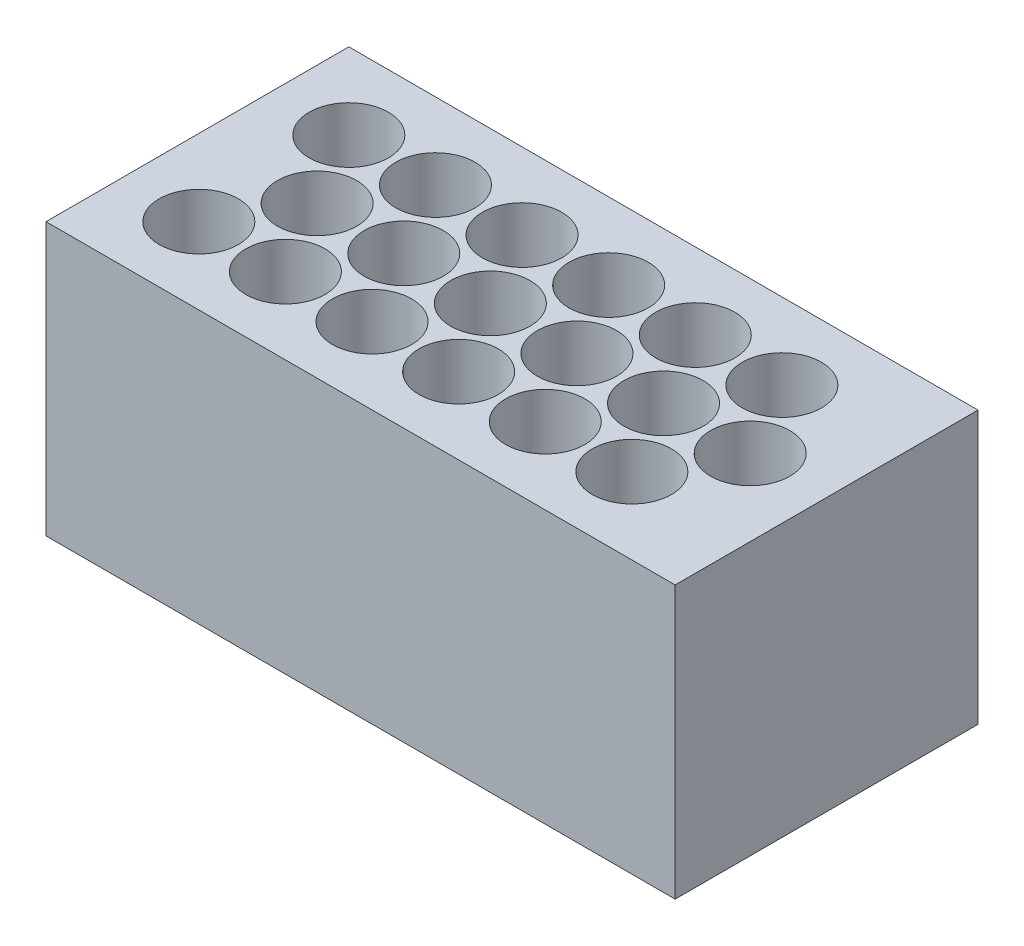
ISO-10303-21;
HEADER;
FILE_DESCRIPTION(('STEP AP214'),'2;1');
FILE_NAME('part.step','',(''),(''),'','','');
FILE_SCHEMA(('AUTOMOTIVE_DESIGN { 1 0 10303 214 1 1 1 1 }'));
ENDSEC;
DATA;
#1=APPLICATION_CONTEXT('core data for automotive mechanical design processes');
#2=APPLICATION_PROTOCOL_DEFINITION('international standard','automotive_design',2000,#1);
#3=PRODUCT_CONTEXT('',#1,'mechanical');
#4=PRODUCT('Part','Part','',(#3));
#5=PRODUCT_RELATED_PRODUCT_CATEGORY('part','',(#4));
#6=PRODUCT_DEFINITION_FORMATION('','',#4);
#7=PRODUCT_DEFINITION_CONTEXT('part definition',#1,'design');
#8=PRODUCT_DEFINITION('design','',#6,#7);
#9=PRODUCT_DEFINITION_SHAPE('','',#8);
#10=(LENGTH_UNIT() NAMED_UNIT(*) SI_UNIT(.MILLI.,.METRE.));
#11=(NAMED_UNIT(*) PLANE_ANGLE_UNIT() SI_UNIT($,.RADIAN.));
#12=(NAMED_UNIT(*) SI_UNIT($,.STERADIAN.) SOLID_ANGLE_UNIT());
#13=UNCERTAINTY_MEASURE_WITH_UNIT(LENGTH_MEASURE(1.E-05),#10,'distance_accuracy_value','');
#14=(GEOMETRIC_REPRESENTATION_CONTEXT(3) GLOBAL_UNCERTAINTY_ASSIGNED_CONTEXT((#13)) GLOBAL_UNIT_ASSIGNED_CONTEXT((#10,
#11,#12)) REPRESENTATION_CONTEXT('',''));
#15=CARTESIAN_POINT('',(0.,0.,0.));
#16=DIRECTION('',(0.,0.,1.));
#17=DIRECTION('',(1.,0.,0.));
#18=AXIS2_PLACEMENT_3D('',#15,#16,#17);
#19=CARTESIAN_POINT('',(0.,74.,0.));
#20=DIRECTION('',(0.,-1.,0.));
#21=DIRECTION('',(0.,0.,-1.));
#22=AXIS2_PLACEMENT_3D('',#19,#20,#21);
#23=PLANE('',#22);
#24=DIRECTION('',(0.,0.,1.));
#25=VECTOR('',#24,1.);
#26=CARTESIAN_POINT('',(-32.5499999999999,74.,41.1698982591236));
#27=LINE('',#26,#25);
#28=CARTESIAN_POINT('',(-32.5499999999999,74.,-41.1698982591236));
#29=VERTEX_POINT('',#28);
#30=CARTESIAN_POINT('',(-32.5499999999999,74.,41.1698982591236));
#31=VERTEX_POINT('',#30);
#32=EDGE_CURVE('E92',#29,#31,#27,.T.);
#33=ORIENTED_EDGE('',*,*,#32,.T.);
#34=DIRECTION('',(1.,0.,0.));
#35=VECTOR('',#34,1.);
#36=CARTESIAN_POINT('',(-32.5499999999999,74.,41.1698982591236));
#37=LINE('',#36,#35);
#38=CARTESIAN_POINT('',(138.525,74.,41.1698982591236));
#39=VERTEX_POINT('',#38);
#40=EDGE_CURVE('E87',#31,#39,#37,.T.);
#41=ORIENTED_EDGE('',*,*,#40,.T.);
#42=DIRECTION('',(0.,0.,-1.));
#43=VECTOR('',#42,1.);
#44=CARTESIAN_POINT('',(138.525,74.,41.1698982591236));
#45=LINE('',#44,#43);
#46=CARTESIAN_POINT('',(138.525,74.,-41.1698982591236));
#47=VERTEX_POINT('',#46);
#48=EDGE_CURVE('E90',#39,#47,#45,.T.);
#49=ORIENTED_EDGE('',*,*,#48,.T.);
#50=DIRECTION('',(-1.,0.,0.));
#51=VECTOR('',#50,1.);
#52=CARTESIAN_POINT('',(-32.5499999999999,74.,-41.1698982591236));
#53=LINE('',#52,#51);
#54=EDGE_CURVE('E57',#47,#29,#53,.T.);
#55=ORIENTED_EDGE('',*,*,#54,.T.);
#56=EDGE_LOOP('',(#33,#41,#49,#55));
#57=FACE_BOUND('',#56,.T.);
#58=CARTESIAN_POINT('',(0.,74.,0.));
#59=DIRECTION('',(0.,1.,0.));
#60=DIRECTION('',(0.,0.,1.));
#61=AXIS2_PLACEMENT_3D('',#58,#59,#60);
#62=CIRCLE('',#61,10.775);
#63=CARTESIAN_POINT('',(0.,74.,10.775));
#64=VERTEX_POINT('',#63);
#65=EDGE_CURVE('E107',#64,#64,#62,.T.);
#66=ORIENTED_EDGE('',*,*,#65,.F.);
#67=EDGE_LOOP('',(#66));
#68=FACE_BOUND('',#67,.T.);
#69=CARTESIAN_POINT('',(-11.7749999999999,74.,-20.3948982591236));
#70=DIRECTION('',(0.,1.,0.));
#71=DIRECTION('',(0.,0.,1.));
#72=AXIS2_PLACEMENT_3D('',#69,#70,#71);
#73=CIRCLE('',#72,10.775);
#74=CARTESIAN_POINT('',(-11.7749999999999,74.,-9.6198982591236));
#75=VERTEX_POINT('',#74);
#76=EDGE_CURVE('E122',#75,#75,#73,.T.);
#77=ORIENTED_EDGE('',*,*,#76,.F.);
#78=EDGE_LOOP('',(#77));
#79=FACE_BOUND('',#78,.T.);
#80=CARTESIAN_POINT('',(-11.7749999999999,74.,20.3948982591236));
#81=DIRECTION('',(0.,1.,0.));
#82=DIRECTION('',(0.,0.,1.));
#83=AXIS2_PLACEMENT_3D('',#80,#81,#82);
#84=CIRCLE('',#83,10.775);
#85=CARTESIAN_POINT('',(-11.7749999999999,74.,31.1698982591236));
#86=VERTEX_POINT('',#85);
#87=EDGE_CURVE('E128',#86,#86,#84,.T.);
#88=ORIENTED_EDGE('',*,*,#87,.F.);
#89=EDGE_LOOP('',(#88));
#90=FACE_BOUND('',#89,.T.);
#91=CARTESIAN_POINT('',(23.55,74.,0.));
#92=DIRECTION('',(0.,1.,0.));
#93=DIRECTION('',(0.,0.,1.));
#94=AXIS2_PLACEMENT_3D('',#91,#92,#93);
#95=CIRCLE('',#94,10.775);
#96=CARTESIAN_POINT('',(23.55,74.,10.775));
#97=VERTEX_POINT('',#96);
#98=EDGE_CURVE('E134',#97,#97,#95,.T.);
#99=ORIENTED_EDGE('',*,*,#98,.F.);
#100=EDGE_LOOP('',(#99));
#101=FACE_BOUND('',#100,.T.);
#102=CARTESIAN_POINT('',(11.7750000000001,74.,-20.3948982591236));
#103=DIRECTION('',(0.,1.,0.));
#104=DIRECTION('',(0.,0.,1.));
#105=AXIS2_PLACEMENT_3D('',#102,#103,#104);
#106=CIRCLE('',#105,10.775);
#107=CARTESIAN_POINT('',(11.7750000000001,74.,-9.6198982591236));
#108=VERTEX_POINT('',#107);
#109=EDGE_CURVE('E140',#108,#108,#106,.T.);
#110=ORIENTED_EDGE('',*,*,#109,.F.);
#111=EDGE_LOOP('',(#110));
#112=FACE_BOUND('',#111,.T.);
#113=CARTESIAN_POINT('',(11.7750000000001,74.,20.3948982591236));
#114=DIRECTION('',(0.,1.,0.));
#115=DIRECTION('',(0.,0.,1.));
#116=AXIS2_PLACEMENT_3D('',#113,#114,#115);
#117=CIRCLE('',#116,10.775);
#118=CARTESIAN_POINT('',(11.7750000000001,74.,31.1698982591236));
#119=VERTEX_POINT('',#118);
#120=EDGE_CURVE('E146',#119,#119,#117,.T.);
#121=ORIENTED_EDGE('',*,*,#120,.F.);
#122=EDGE_LOOP('',(#121));
#123=FACE_BOUND('',#122,.T.);
#124=CARTESIAN_POINT('',(47.1,74.,0.));
#125=DIRECTION('',(0.,1.,0.));
#126=DIRECTION('',(0.,0.,1.));
#127=AXIS2_PLACEMENT_3D('',#124,#125,#126);
#128=CIRCLE('',#127,10.775);
#129=CARTESIAN_POINT('',(47.1,74.,10.775));
#130=VERTEX_POINT('',#129);
#131=EDGE_CURVE('E152',#130,#130,#128,.T.);
#132=ORIENTED_EDGE('',*,*,#131,.F.);
#133=EDGE_LOOP('',(#132));
#134=FACE_BOUND('',#133,.T.);
#135=CARTESIAN_POINT('',(35.3250000000001,74.,-20.3948982591236));
#136=DIRECTION('',(0.,1.,0.));
#137=DIRECTION('',(0.,0.,1.));
#138=AXIS2_PLACEMENT_3D('',#135,#136,#137);
#139=CIRCLE('',#138,10.775);
#140=CARTESIAN_POINT('',(35.3250000000001,74.,-9.61989825912359));
#141=VERTEX_POINT('',#140);
#142=EDGE_CURVE('E158',#141,#141,#139,.T.);
#143=ORIENTED_EDGE('',*,*,#142,.F.);
#144=EDGE_LOOP('',(#143));
#145=FACE_BOUND('',#144,.T.);
#146=CARTESIAN_POINT('',(35.3250000000001,74.,20.3948982591236));
#147=DIRECTION('',(0.,1.,0.));
#148=DIRECTION('',(0.,0.,1.));
#149=AXIS2_PLACEMENT_3D('',#146,#147,#148);
#150=CIRCLE('',#149,10.775);
#151=CARTESIAN_POINT('',(35.3250000000001,74.,31.1698982591236));
#152=VERTEX_POINT('',#151);
#153=EDGE_CURVE('E164',#152,#152,#150,.T.);
#154=ORIENTED_EDGE('',*,*,#153,.F.);
#155=EDGE_LOOP('',(#154));
#156=FACE_BOUND('',#155,.T.);
#157=CARTESIAN_POINT('',(70.65,74.,0.));
#158=DIRECTION('',(0.,1.,0.));
#159=DIRECTION('',(0.,0.,1.));
#160=AXIS2_PLACEMENT_3D('',#157,#158,#159);
#161=CIRCLE('',#160,10.775);
#162=CARTESIAN_POINT('',(70.65,74.,10.775));
#163=VERTEX_POINT('',#162);
#164=EDGE_CURVE('E170',#163,#163,#161,.T.);
#165=ORIENTED_EDGE('',*,*,#164,.F.);
#166=EDGE_LOOP('',(#165));
#167=FACE_BOUND('',#166,.T.);
#168=CARTESIAN_POINT('',(58.8750000000001,74.,-20.3948982591236));
#169=DIRECTION('',(0.,1.,0.));
#170=DIRECTION('',(0.,0.,1.));
#171=AXIS2_PLACEMENT_3D('',#168,#169,#170);
#172=CIRCLE('',#171,10.775);
#173=CARTESIAN_POINT('',(58.8750000000001,74.,-9.61989825912359));
#174=VERTEX_POINT('',#173);
#175=EDGE_CURVE('E176',#174,#174,#172,.T.);
#176=ORIENTED_EDGE('',*,*,#175,.F.);
#177=EDGE_LOOP('',(#176));
#178=FACE_BOUND('',#177,.T.);
#179=CARTESIAN_POINT('',(58.8750000000001,74.,20.3948982591236));
#180=DIRECTION('',(0.,1.,0.));
#181=DIRECTION('',(0.,0.,1.));
#182=AXIS2_PLACEMENT_3D('',#179,#180,#181);
#183=CIRCLE('',#182,10.775);
#184=CARTESIAN_POINT('',(58.8750000000001,74.,31.1698982591236));
#185=VERTEX_POINT('',#184);
#186=EDGE_CURVE('E182',#185,#185,#183,.T.);
#187=ORIENTED_EDGE('',*,*,#186,.F.);
#188=EDGE_LOOP('',(#187));
#189=FACE_BOUND('',#188,.T.);
#190=CARTESIAN_POINT('',(94.2,74.,0.));
#191=DIRECTION('',(0.,1.,0.));
#192=DIRECTION('',(0.,0.,1.));
#193=AXIS2_PLACEMENT_3D('',#190,#191,#192);
#194=CIRCLE('',#193,10.775);
#195=CARTESIAN_POINT('',(94.2,74.,10.775));
#196=VERTEX_POINT('',#195);
#197=EDGE_CURVE('E188',#196,#196,#194,.T.);
#198=ORIENTED_EDGE('',*,*,#197,.F.);
#199=EDGE_LOOP('',(#198));
#200=FACE_BOUND('',#199,.T.);
#201=CARTESIAN_POINT('',(82.4250000000001,74.,-20.3948982591236));
#202=DIRECTION('',(0.,1.,0.));
#203=DIRECTION('',(0.,0.,1.));
#204=AXIS2_PLACEMENT_3D('',#201,#202,#203);
#205=CIRCLE('',#204,10.775);
#206=CARTESIAN_POINT('',(82.4250000000001,74.,-9.61989825912359));
#207=VERTEX_POINT('',#206);
#208=EDGE_CURVE('E194',#207,#207,#205,.T.);
#209=ORIENTED_EDGE('',*,*,#208,.F.);
#210=EDGE_LOOP('',(#209));
#211=FACE_BOUND('',#210,.T.);
#212=CARTESIAN_POINT('',(82.4250000000001,74.,20.3948982591236));
#213=DIRECTION('',(0.,1.,0.));
#214=DIRECTION('',(0.,0.,1.));
#215=AXIS2_PLACEMENT_3D('',#212,#213,#214);
#216=CIRCLE('',#215,10.775);
#217=CARTESIAN_POINT('',(82.4250000000001,74.,31.1698982591236));
#218=VERTEX_POINT('',#217);
#219=EDGE_CURVE('E200',#218,#218,#216,.T.);
#220=ORIENTED_EDGE('',*,*,#219,.F.);
#221=EDGE_LOOP('',(#220));
#222=FACE_BOUND('',#221,.T.);
#223=CARTESIAN_POINT('',(117.75,74.,0.));
#224=DIRECTION('',(0.,1.,0.));
#225=DIRECTION('',(0.,0.,1.));
#226=AXIS2_PLACEMENT_3D('',#223,#224,#225);
#227=CIRCLE('',#226,10.775);
#228=CARTESIAN_POINT('',(117.75,74.,10.775));
#229=VERTEX_POINT('',#228);
#230=EDGE_CURVE('E206',#229,#229,#227,.T.);
#231=ORIENTED_EDGE('',*,*,#230,.F.);
#232=EDGE_LOOP('',(#231));
#233=FACE_BOUND('',#232,.T.);
#234=CARTESIAN_POINT('',(105.975,74.,-20.3948982591236));
#235=DIRECTION('',(0.,1.,0.));
#236=DIRECTION('',(0.,0.,1.));
#237=AXIS2_PLACEMENT_3D('',#234,#235,#236);
#238=CIRCLE('',#237,10.775);
#239=CARTESIAN_POINT('',(105.975,74.,-9.61989825912359));
#240=VERTEX_POINT('',#239);
#241=EDGE_CURVE('E212',#240,#240,#238,.T.);
#242=ORIENTED_EDGE('',*,*,#241,.F.);
#243=EDGE_LOOP('',(#242));
#244=FACE_BOUND('',#243,.T.);
#245=CARTESIAN_POINT('',(105.975,74.,20.3948982591236));
#246=DIRECTION('',(0.,1.,0.));
#247=DIRECTION('',(0.,0.,1.));
#248=AXIS2_PLACEMENT_3D('',#245,#246,#247);
#249=CIRCLE('',#248,10.775);
#250=CARTESIAN_POINT('',(105.975,74.,31.1698982591236));
#251=VERTEX_POINT('',#250);
#252=EDGE_CURVE('E218',#251,#251,#249,.T.);
#253=ORIENTED_EDGE('',*,*,#252,.F.);
#254=EDGE_LOOP('',(#253));
#255=FACE_BOUND('',#254,.T.);
#256=ADVANCED_FACE('F40',(#57,#68,#79,#90,#101,#112,#123,#134,#145,#156,#167,#178,#189,#200,
#211,#222,#233,#244,#255),#23,.F.);
#257=CARTESIAN_POINT('',(0.,0.,0.));
#258=DIRECTION('',(0.,-1.,0.));
#259=DIRECTION('',(0.,0.,-1.));
#260=AXIS2_PLACEMENT_3D('',#257,#258,#259);
#261=PLANE('',#260);
#262=CARTESIAN_POINT('',(105.975,0.,-20.3948982591236));
#263=DIRECTION('',(0.,1.,0.));
#264=DIRECTION('',(0.,0.,1.));
#265=AXIS2_PLACEMENT_3D('',#262,#263,#264);
#266=CIRCLE('',#265,10.775);
#267=CARTESIAN_POINT('',(105.975,0.,-9.61989825912359));
#268=VERTEX_POINT('',#267);
#269=EDGE_CURVE('E215',#268,#268,#266,.T.);
#270=ORIENTED_EDGE('',*,*,#269,.T.);
#271=EDGE_LOOP('',(#270));
#272=FACE_BOUND('',#271,.T.);
#273=CARTESIAN_POINT('',(82.4250000000001,0.,20.3948982591236));
#274=DIRECTION('',(0.,1.,0.));
#275=DIRECTION('',(0.,0.,1.));
#276=AXIS2_PLACEMENT_3D('',#273,#274,#275);
#277=CIRCLE('',#276,10.775);
#278=CARTESIAN_POINT('',(82.4250000000001,0.,31.1698982591236));
#279=VERTEX_POINT('',#278);
#280=EDGE_CURVE('E203',#279,#279,#277,.T.);
#281=ORIENTED_EDGE('',*,*,#280,.T.);
#282=EDGE_LOOP('',(#281));
#283=FACE_BOUND('',#282,.T.);
#284=CARTESIAN_POINT('',(94.2,0.,0.));
#285=DIRECTION('',(0.,1.,0.));
#286=DIRECTION('',(0.,0.,1.));
#287=AXIS2_PLACEMENT_3D('',#284,#285,#286);
#288=CIRCLE('',#287,10.775);
#289=CARTESIAN_POINT('',(94.2,0.,10.775));
#290=VERTEX_POINT('',#289);
#291=EDGE_CURVE('E191',#290,#290,#288,.T.);
#292=ORIENTED_EDGE('',*,*,#291,.T.);
#293=EDGE_LOOP('',(#292));
#294=FACE_BOUND('',#293,.T.);
#295=CARTESIAN_POINT('',(58.8750000000001,0.,-20.3948982591236));
#296=DIRECTION('',(0.,1.,0.));
#297=DIRECTION('',(0.,0.,1.));
#298=AXIS2_PLACEMENT_3D('',#295,#296,#297);
#299=CIRCLE('',#298,10.775);
#300=CARTESIAN_POINT('',(58.8750000000001,0.,-9.61989825912359));
#301=VERTEX_POINT('',#300);
#302=EDGE_CURVE('E179',#301,#301,#299,.T.);
#303=ORIENTED_EDGE('',*,*,#302,.T.);
#304=EDGE_LOOP('',(#303));
#305=FACE_BOUND('',#304,.T.);
#306=CARTESIAN_POINT('',(35.3250000000001,0.,20.3948982591236));
#307=DIRECTION('',(0.,1.,0.));
#308=DIRECTION('',(0.,0.,1.));
#309=AXIS2_PLACEMENT_3D('',#306,#307,#308);
#310=CIRCLE('',#309,10.775);
#311=CARTESIAN_POINT('',(35.3250000000001,0.,31.1698982591236));
#312=VERTEX_POINT('',#311);
#313=EDGE_CURVE('E167',#312,#312,#310,.T.);
#314=ORIENTED_EDGE('',*,*,#313,.T.);
#315=EDGE_LOOP('',(#314));
#316=FACE_BOUND('',#315,.T.);
#317=CARTESIAN_POINT('',(47.1,0.,0.));
#318=DIRECTION('',(0.,1.,0.));
#319=DIRECTION('',(0.,0.,1.));
#320=AXIS2_PLACEMENT_3D('',#317,#318,#319);
#321=CIRCLE('',#320,10.775);
#322=CARTESIAN_POINT('',(47.1,0.,10.775));
#323=VERTEX_POINT('',#322);
#324=EDGE_CURVE('E155',#323,#323,#321,.T.);
#325=ORIENTED_EDGE('',*,*,#324,.T.);
#326=EDGE_LOOP('',(#325));
#327=FACE_BOUND('',#326,.T.);
#328=CARTESIAN_POINT('',(11.7750000000001,0.,-20.3948982591236));
#329=DIRECTION('',(0.,1.,0.));
#330=DIRECTION('',(0.,0.,1.));
#331=AXIS2_PLACEMENT_3D('',#328,#329,#330);
#332=CIRCLE('',#331,10.775);
#333=CARTESIAN_POINT('',(11.7750000000001,0.,-9.6198982591236));
#334=VERTEX_POINT('',#333);
#335=EDGE_CURVE('E143',#334,#334,#332,.T.);
#336=ORIENTED_EDGE('',*,*,#335,.T.);
#337=EDGE_LOOP('',(#336));
#338=FACE_BOUND('',#337,.T.);
#339=CARTESIAN_POINT('',(-11.7749999999999,0.,20.3948982591236));
#340=DIRECTION('',(0.,1.,0.));
#341=DIRECTION('',(0.,0.,1.));
#342=AXIS2_PLACEMENT_3D('',#339,#340,#341);
#343=CIRCLE('',#342,10.775);
#344=CARTESIAN_POINT('',(-11.7749999999999,0.,31.1698982591236));
#345=VERTEX_POINT('',#344);
#346=EDGE_CURVE('E131',#345,#345,#343,.T.);
#347=ORIENTED_EDGE('',*,*,#346,.T.);
#348=EDGE_LOOP('',(#347));
#349=FACE_BOUND('',#348,.T.);
#350=CARTESIAN_POINT('',(0.,0.,0.));
#351=DIRECTION('',(0.,1.,0.));
#352=DIRECTION('',(0.,0.,1.));
#353=AXIS2_PLACEMENT_3D('',#350,#351,#352);
#354=CIRCLE('',#353,10.775);
#355=CARTESIAN_POINT('',(0.,0.,10.775));
#356=VERTEX_POINT('',#355);
#357=EDGE_CURVE('E119',#356,#356,#354,.T.);
#358=ORIENTED_EDGE('',*,*,#357,.T.);
#359=EDGE_LOOP('',(#358));
#360=FACE_BOUND('',#359,.T.);
#361=DIRECTION('',(0.,0.,1.));
#362=VECTOR('',#361,1.);
#363=CARTESIAN_POINT('',(-32.5499999999999,0.,41.1698982591236));
#364=LINE('',#363,#362);
#365=CARTESIAN_POINT('',(-32.5499999999999,0.,-41.1698982591236));
#366=VERTEX_POINT('',#365);
#367=CARTESIAN_POINT('',(-32.5499999999999,0.,41.1698982591236));
#368=VERTEX_POINT('',#367);
#369=EDGE_CURVE('E104',#366,#368,#364,.T.);
#370=ORIENTED_EDGE('',*,*,#369,.F.);
#371=DIRECTION('',(-1.,0.,0.));
#372=VECTOR('',#371,1.);
#373=CARTESIAN_POINT('',(-32.5499999999999,0.,-41.1698982591236));
#374=LINE('',#373,#372);
#375=CARTESIAN_POINT('',(138.525,0.,-41.1698982591236));
#376=VERTEX_POINT('',#375);
#377=EDGE_CURVE('E80',#376,#366,#374,.T.);
#378=ORIENTED_EDGE('',*,*,#377,.F.);
#379=DIRECTION('',(0.,0.,-1.));
#380=VECTOR('',#379,1.);
#381=CARTESIAN_POINT('',(138.525,0.,41.1698982591236));
#382=LINE('',#381,#380);
#383=CARTESIAN_POINT('',(138.525,0.,41.1698982591236));
#384=VERTEX_POINT('',#383);
#385=EDGE_CURVE('E74',#384,#376,#382,.T.);
#386=ORIENTED_EDGE('',*,*,#385,.F.);
#387=DIRECTION('',(1.,0.,0.));
#388=VECTOR('',#387,1.);
#389=CARTESIAN_POINT('',(-32.5499999999999,0.,41.1698982591236));
#390=LINE('',#389,#388);
#391=EDGE_CURVE('E96',#368,#384,#390,.T.);
#392=ORIENTED_EDGE('',*,*,#391,.F.);
#393=EDGE_LOOP('',(#370,#378,#386,#392));
#394=FACE_BOUND('',#393,.T.);
#395=CARTESIAN_POINT('',(-11.7749999999999,0.,-20.3948982591236));
#396=DIRECTION('',(0.,1.,0.));
#397=DIRECTION('',(0.,0.,1.));
#398=AXIS2_PLACEMENT_3D('',#395,#396,#397);
#399=CIRCLE('',#398,10.775);
#400=CARTESIAN_POINT('',(-11.7749999999999,0.,-9.6198982591236));
#401=VERTEX_POINT('',#400);
#402=EDGE_CURVE('E125',#401,#401,#399,.T.);
#403=ORIENTED_EDGE('',*,*,#402,.T.);
#404=EDGE_LOOP('',(#403));
#405=FACE_BOUND('',#404,.T.);
#406=CARTESIAN_POINT('',(23.55,0.,0.));
#407=DIRECTION('',(0.,1.,0.));
#408=DIRECTION('',(0.,0.,1.));
#409=AXIS2_PLACEMENT_3D('',#406,#407,#408);
#410=CIRCLE('',#409,10.775);
#411=CARTESIAN_POINT('',(23.55,0.,10.775));
#412=VERTEX_POINT('',#411);
#413=EDGE_CURVE('E137',#412,#412,#410,.T.);
#414=ORIENTED_EDGE('',*,*,#413,.T.);
#415=EDGE_LOOP('',(#414));
#416=FACE_BOUND('',#415,.T.);
#417=CARTESIAN_POINT('',(11.7750000000001,0.,20.3948982591236));
#418=DIRECTION('',(0.,1.,0.));
#419=DIRECTION('',(0.,0.,1.));
#420=AXIS2_PLACEMENT_3D('',#417,#418,#419);
#421=CIRCLE('',#420,10.775);
#422=CARTESIAN_POINT('',(11.7750000000001,0.,31.1698982591236));
#423=VERTEX_POINT('',#422);
#424=EDGE_CURVE('E149',#423,#423,#421,.T.);
#425=ORIENTED_EDGE('',*,*,#424,.T.);
#426=EDGE_LOOP('',(#425));
#427=FACE_BOUND('',#426,.T.);
#428=CARTESIAN_POINT('',(35.3250000000001,0.,-20.3948982591236));
#429=DIRECTION('',(0.,1.,0.));
#430=DIRECTION('',(0.,0.,1.));
#431=AXIS2_PLACEMENT_3D('',#428,#429,#430);
#432=CIRCLE('',#431,10.775);
#433=CARTESIAN_POINT('',(35.3250000000001,0.,-9.61989825912359));
#434=VERTEX_POINT('',#433);
#435=EDGE_CURVE('E161',#434,#434,#432,.T.);
#436=ORIENTED_EDGE('',*,*,#435,.T.);
#437=EDGE_LOOP('',(#436));
#438=FACE_BOUND('',#437,.T.);
#439=CARTESIAN_POINT('',(70.65,0.,0.));
#440=DIRECTION('',(0.,1.,0.));
#441=DIRECTION('',(0.,0.,1.));
#442=AXIS2_PLACEMENT_3D('',#439,#440,#441);
#443=CIRCLE('',#442,10.775);
#444=CARTESIAN_POINT('',(70.65,0.,10.775));
#445=VERTEX_POINT('',#444);
#446=EDGE_CURVE('E173',#445,#445,#443,.T.);
#447=ORIENTED_EDGE('',*,*,#446,.T.);
#448=EDGE_LOOP('',(#447));
#449=FACE_BOUND('',#448,.T.);
#450=CARTESIAN_POINT('',(58.8750000000001,0.,20.3948982591236));
#451=DIRECTION('',(0.,1.,0.));
#452=DIRECTION('',(0.,0.,1.));
#453=AXIS2_PLACEMENT_3D('',#450,#451,#452);
#454=CIRCLE('',#453,10.775);
#455=CARTESIAN_POINT('',(58.8750000000001,0.,31.1698982591236));
#456=VERTEX_POINT('',#455);
#457=EDGE_CURVE('E185',#456,#456,#454,.T.);
#458=ORIENTED_EDGE('',*,*,#457,.T.);
#459=EDGE_LOOP('',(#458));
#460=FACE_BOUND('',#459,.T.);
#461=CARTESIAN_POINT('',(82.4250000000001,0.,-20.3948982591236));
#462=DIRECTION('',(0.,1.,0.));
#463=DIRECTION('',(0.,0.,1.));
#464=AXIS2_PLACEMENT_3D('',#461,#462,#463);
#465=CIRCLE('',#464,10.775);
#466=CARTESIAN_POINT('',(82.4250000000001,0.,-9.61989825912359));
#467=VERTEX_POINT('',#466);
#468=EDGE_CURVE('E197',#467,#467,#465,.T.);
#469=ORIENTED_EDGE('',*,*,#468,.T.);
#470=EDGE_LOOP('',(#469));
#471=FACE_BOUND('',#470,.T.);
#472=CARTESIAN_POINT('',(117.75,0.,0.));
#473=DIRECTION('',(0.,1.,0.));
#474=DIRECTION('',(0.,0.,1.));
#475=AXIS2_PLACEMENT_3D('',#472,#473,#474);
#476=CIRCLE('',#475,10.775);
#477=CARTESIAN_POINT('',(117.75,0.,10.775));
#478=VERTEX_POINT('',#477);
#479=EDGE_CURVE('E209',#478,#478,#476,.T.);
#480=ORIENTED_EDGE('',*,*,#479,.T.);
#481=EDGE_LOOP('',(#480));
#482=FACE_BOUND('',#481,.T.);
#483=CARTESIAN_POINT('',(105.975,0.,20.3948982591236));
#484=DIRECTION('',(0.,1.,0.));
#485=DIRECTION('',(0.,0.,1.));
#486=AXIS2_PLACEMENT_3D('',#483,#484,#485);
#487=CIRCLE('',#486,10.775);
#488=CARTESIAN_POINT('',(105.975,0.,31.1698982591236));
#489=VERTEX_POINT('',#488);
#490=EDGE_CURVE('E221',#489,#489,#487,.T.);
#491=ORIENTED_EDGE('',*,*,#490,.T.);
#492=EDGE_LOOP('',(#491));
#493=FACE_BOUND('',#492,.T.);
#494=ADVANCED_FACE('F115',(#272,#283,#294,#305,#316,#327,#338,#349,#360,#394,#405,#416,#427,
#438,#449,#460,#471,#482,#493),#261,.T.);
#495=CARTESIAN_POINT('',(-32.5499999999999,74.,41.1698982591236));
#496=DIRECTION('',(1.,0.,0.));
#497=DIRECTION('',(0.,0.,-1.));
#498=AXIS2_PLACEMENT_3D('',#495,#496,#497);
#499=PLANE('',#498);
#500=CARTESIAN_POINT('',(-32.5499999999999,5.64562724240524,-37.7774312739622));
#501=DIRECTION('',(-1.,0.,0.));
#502=DIRECTION('',(0.,0.,1.));
#503=AXIS2_PLACEMENT_3D('',#500,#501,#502);
#504=CIRCLE('',#503,2.5);
#505=CARTESIAN_POINT('',(-32.5499999999999,5.64562724240524,-35.2774312739622));
#506=VERTEX_POINT('',#505);
#507=EDGE_CURVE('E236',#506,#506,#504,.T.);
#508=ORIENTED_EDGE('',*,*,#507,.F.);
#509=EDGE_LOOP('',(#508));
#510=FACE_BOUND('',#509,.T.);
#511=CARTESIAN_POINT('',(-32.5499999999999,6.45130705630491,34.7337519770079));
#512=DIRECTION('',(-1.,0.,0.));
#513=DIRECTION('',(0.,0.,1.));
#514=AXIS2_PLACEMENT_3D('',#511,#512,#513);
#515=CIRCLE('',#514,2.5);
#516=CARTESIAN_POINT('',(-32.5499999999999,6.45130705630491,37.2337519770079));
#517=VERTEX_POINT('',#516);
#518=EDGE_CURVE('E242',#517,#517,#515,.T.);
#519=ORIENTED_EDGE('',*,*,#518,.F.);
#520=EDGE_LOOP('',(#519));
#521=FACE_BOUND('',#520,.T.);
#522=CARTESIAN_POINT('',(-32.5499999999999,70.9056921682783,36.747951511757));
#523=DIRECTION('',(-1.,0.,0.));
#524=DIRECTION('',(0.,0.,1.));
#525=AXIS2_PLACEMENT_3D('',#522,#523,#524);
#526=CIRCLE('',#525,2.5);
#527=CARTESIAN_POINT('',(-32.5499999999999,70.9056921682783,39.2479515117571));
#528=VERTEX_POINT('',#527);
#529=EDGE_CURVE('E230',#528,#528,#526,.T.);
#530=ORIENTED_EDGE('',*,*,#529,.F.);
#531=EDGE_LOOP('',(#530));
#532=FACE_BOUND('',#531,.T.);
#533=CARTESIAN_POINT('',(-32.5499999999999,70.0104923750564,-37.3298313773512));
#534=DIRECTION('',(-1.,0.,0.));
#535=DIRECTION('',(0.,0.,1.));
#536=AXIS2_PLACEMENT_3D('',#533,#534,#535);
#537=CIRCLE('',#536,2.5);
#538=CARTESIAN_POINT('',(-32.5499999999999,70.0104923750564,-34.8298313773512));
#539=VERTEX_POINT('',#538);
#540=EDGE_CURVE('E227',#539,#539,#537,.T.);
#541=ORIENTED_EDGE('',*,*,#540,.F.);
#542=EDGE_LOOP('',(#541));
#543=FACE_BOUND('',#542,.T.);
#544=ORIENTED_EDGE('',*,*,#369,.T.);
#545=DIRECTION('',(0.,-1.,0.));
#546=VECTOR('',#545,1.);
#547=CARTESIAN_POINT('',(-32.5499999999999,74.,41.1698982591236));
#548=LINE('',#547,#546);
#549=EDGE_CURVE('E11',#31,#368,#548,.T.);
#550=ORIENTED_EDGE('',*,*,#549,.F.);
#551=ORIENTED_EDGE('',*,*,#32,.F.);
#552=DIRECTION('',(0.,-1.,0.));
#553=VECTOR('',#552,1.);
#554=CARTESIAN_POINT('',(-32.5499999999999,74.,-41.1698982591236));
#555=LINE('',#554,#553);
#556=EDGE_CURVE('E100',#29,#366,#555,.T.);
#557=ORIENTED_EDGE('',*,*,#556,.T.);
#558=EDGE_LOOP('',(#544,#550,#551,#557));
#559=FACE_BOUND('',#558,.T.);
#560=ADVANCED_FACE('F42',(#510,#521,#532,#543,#559),#499,.F.);
#561=CARTESIAN_POINT('',(-32.5499999999999,74.,41.1698982591236));
#562=DIRECTION('',(0.,0.,-1.));
#563=DIRECTION('',(-1.,0.,0.));
#564=AXIS2_PLACEMENT_3D('',#561,#562,#563);
#565=PLANE('',#564);
#566=ORIENTED_EDGE('',*,*,#391,.T.);
#567=DIRECTION('',(0.,-1.,0.));
#568=VECTOR('',#567,1.);
#569=CARTESIAN_POINT('',(138.525,74.,41.1698982591236));
#570=LINE('',#569,#568);
#571=EDGE_CURVE('E49',#39,#384,#570,.T.);
#572=ORIENTED_EDGE('',*,*,#571,.F.);
#573=ORIENTED_EDGE('',*,*,#40,.F.);
#574=ORIENTED_EDGE('',*,*,#549,.T.);
#575=EDGE_LOOP('',(#566,#572,#573,#574));
#576=FACE_BOUND('',#575,.T.);
#577=ADVANCED_FACE('F95',(#576),#565,.F.);
#578=CARTESIAN_POINT('',(138.525,74.,41.1698982591236));
#579=DIRECTION('',(-1.,0.,0.));
#580=DIRECTION('',(0.,0.,1.));
#581=AXIS2_PLACEMENT_3D('',#578,#579,#580);
#582=PLANE('',#581);
#583=ORIENTED_EDGE('',*,*,#385,.T.);
#584=DIRECTION('',(0.,-1.,0.));
#585=VECTOR('',#584,1.);
#586=CARTESIAN_POINT('',(138.525,74.,-41.1698982591236));
#587=LINE('',#586,#585);
#588=EDGE_CURVE('E97',#47,#376,#587,.T.);
#589=ORIENTED_EDGE('',*,*,#588,.F.);
#590=ORIENTED_EDGE('',*,*,#48,.F.);
#591=ORIENTED_EDGE('',*,*,#571,.T.);
#592=EDGE_LOOP('',(#583,#589,#590,#591));
#593=FACE_BOUND('',#592,.T.);
#594=ADVANCED_FACE('F98',(#593),#582,.F.);
#595=CARTESIAN_POINT('',(-32.5499999999999,74.,-41.1698982591236));
#596=DIRECTION('',(0.,0.,1.));
#597=DIRECTION('',(1.,0.,0.));
#598=AXIS2_PLACEMENT_3D('',#595,#596,#597);
#599=PLANE('',#598);
#600=ORIENTED_EDGE('',*,*,#377,.T.);
#601=ORIENTED_EDGE('',*,*,#556,.F.);
#602=ORIENTED_EDGE('',*,*,#54,.F.);
#603=ORIENTED_EDGE('',*,*,#588,.T.);
#604=EDGE_LOOP('',(#600,#601,#602,#603));
#605=FACE_BOUND('',#604,.T.);
#606=ADVANCED_FACE('F112',(#605),#599,.F.);
#607=CARTESIAN_POINT('',(0.,74.,0.));
#608=DIRECTION('',(0.,-1.,0.));
#609=DIRECTION('',(0.,0.,-1.));
#610=AXIS2_PLACEMENT_3D('',#607,#608,#609);
#611=CYLINDRICAL_SURFACE('',#610,10.775);
#612=ORIENTED_EDGE('',*,*,#65,.T.);
#613=EDGE_LOOP('',(#612));
#614=FACE_BOUND('',#613,.T.);
#615=ORIENTED_EDGE('',*,*,#357,.F.);
#616=EDGE_LOOP('',(#615));
#617=FACE_BOUND('',#616,.T.);
#618=ADVANCED_FACE('F282',(#614,#617),#611,.F.);
#619=CARTESIAN_POINT('',(-11.7749999999999,74.,-20.3948982591236));
#620=DIRECTION('',(0.,-1.,0.));
#621=DIRECTION('',(0.,0.,-1.));
#622=AXIS2_PLACEMENT_3D('',#619,#620,#621);
#623=CYLINDRICAL_SURFACE('',#622,10.775);
#624=ORIENTED_EDGE('',*,*,#76,.T.);
#625=EDGE_LOOP('',(#624));
#626=FACE_BOUND('',#625,.T.);
#627=ORIENTED_EDGE('',*,*,#402,.F.);
#628=EDGE_LOOP('',(#627));
#629=FACE_BOUND('',#628,.T.);
#630=ADVANCED_FACE('F311',(#626,#629),#623,.F.);
#631=CARTESIAN_POINT('',(-11.7749999999999,74.,20.3948982591236));
#632=DIRECTION('',(0.,-1.,0.));
#633=DIRECTION('',(0.,0.,-1.));
#634=AXIS2_PLACEMENT_3D('',#631,#632,#633);
#635=CYLINDRICAL_SURFACE('',#634,10.775);
#636=ORIENTED_EDGE('',*,*,#87,.T.);
#637=EDGE_LOOP('',(#636));
#638=FACE_BOUND('',#637,.T.);
#639=ORIENTED_EDGE('',*,*,#346,.F.);
#640=EDGE_LOOP('',(#639));
#641=FACE_BOUND('',#640,.T.);
#642=ADVANCED_FACE('F319',(#638,#641),#635,.F.);
#643=CARTESIAN_POINT('',(23.55,74.,0.));
#644=DIRECTION('',(0.,-1.,0.));
#645=DIRECTION('',(0.,0.,-1.));
#646=AXIS2_PLACEMENT_3D('',#643,#644,#645);
#647=CYLINDRICAL_SURFACE('',#646,10.775);
#648=ORIENTED_EDGE('',*,*,#98,.T.);
#649=EDGE_LOOP('',(#648));
#650=FACE_BOUND('',#649,.T.);
#651=ORIENTED_EDGE('',*,*,#413,.F.);
#652=EDGE_LOOP('',(#651));
#653=FACE_BOUND('',#652,.T.);
#654=ADVANCED_FACE('F327',(#650,#653),#647,.F.);
#655=CARTESIAN_POINT('',(11.7750000000001,74.,-20.3948982591236));
#656=DIRECTION('',(0.,-1.,0.));
#657=DIRECTION('',(0.,0.,-1.));
#658=AXIS2_PLACEMENT_3D('',#655,#656,#657);
#659=CYLINDRICAL_SURFACE('',#658,10.775);
#660=ORIENTED_EDGE('',*,*,#109,.T.);
#661=EDGE_LOOP('',(#660));
#662=FACE_BOUND('',#661,.T.);
#663=ORIENTED_EDGE('',*,*,#335,.F.);
#664=EDGE_LOOP('',(#663));
#665=FACE_BOUND('',#664,.T.);
#666=ADVANCED_FACE('F336',(#662,#665),#659,.F.);
#667=CARTESIAN_POINT('',(11.7750000000001,74.,20.3948982591236));
#668=DIRECTION('',(0.,-1.,0.));
#669=DIRECTION('',(0.,0.,-1.));
#670=AXIS2_PLACEMENT_3D('',#667,#668,#669);
#671=CYLINDRICAL_SURFACE('',#670,10.775);
#672=ORIENTED_EDGE('',*,*,#120,.T.);
#673=EDGE_LOOP('',(#672));
#674=FACE_BOUND('',#673,.T.);
#675=ORIENTED_EDGE('',*,*,#424,.F.);
#676=EDGE_LOOP('',(#675));
#677=FACE_BOUND('',#676,.T.);
#678=ADVANCED_FACE('F345',(#674,#677),#671,.F.);
#679=CARTESIAN_POINT('',(47.1,74.,0.));
#680=DIRECTION('',(0.,-1.,0.));
#681=DIRECTION('',(0.,0.,-1.));
#682=AXIS2_PLACEMENT_3D('',#679,#680,#681);
#683=CYLINDRICAL_SURFACE('',#682,10.775);
#684=ORIENTED_EDGE('',*,*,#131,.T.);
#685=EDGE_LOOP('',(#684));
#686=FACE_BOUND('',#685,.T.);
#687=ORIENTED_EDGE('',*,*,#324,.F.);
#688=EDGE_LOOP('',(#687));
#689=FACE_BOUND('',#688,.T.);
#690=ADVANCED_FACE('F354',(#686,#689),#683,.F.);
#691=CARTESIAN_POINT('',(35.3250000000001,74.,-20.3948982591236));
#692=DIRECTION('',(0.,-1.,0.));
#693=DIRECTION('',(0.,0.,-1.));
#694=AXIS2_PLACEMENT_3D('',#691,#692,#693);
#695=CYLINDRICAL_SURFACE('',#694,10.775);
#696=ORIENTED_EDGE('',*,*,#142,.T.);
#697=EDGE_LOOP('',(#696));
#698=FACE_BOUND('',#697,.T.);
#699=ORIENTED_EDGE('',*,*,#435,.F.);
#700=EDGE_LOOP('',(#699));
#701=FACE_BOUND('',#700,.T.);
#702=ADVANCED_FACE('F363',(#698,#701),#695,.F.);
#703=CARTESIAN_POINT('',(35.3250000000001,74.,20.3948982591236));
#704=DIRECTION('',(0.,-1.,0.));
#705=DIRECTION('',(0.,0.,-1.));
#706=AXIS2_PLACEMENT_3D('',#703,#704,#705);
#707=CYLINDRICAL_SURFACE('',#706,10.775);
#708=ORIENTED_EDGE('',*,*,#153,.T.);
#709=EDGE_LOOP('',(#708));
#710=FACE_BOUND('',#709,.T.);
#711=ORIENTED_EDGE('',*,*,#313,.F.);
#712=EDGE_LOOP('',(#711));
#713=FACE_BOUND('',#712,.T.);
#714=ADVANCED_FACE('F372',(#710,#713),#707,.F.);
#715=CARTESIAN_POINT('',(70.65,74.,0.));
#716=DIRECTION('',(0.,-1.,0.));
#717=DIRECTION('',(0.,0.,-1.));
#718=AXIS2_PLACEMENT_3D('',#715,#716,#717);
#719=CYLINDRICAL_SURFACE('',#718,10.775);
#720=ORIENTED_EDGE('',*,*,#164,.T.);
#721=EDGE_LOOP('',(#720));
#722=FACE_BOUND('',#721,.T.);
#723=ORIENTED_EDGE('',*,*,#446,.F.);
#724=EDGE_LOOP('',(#723));
#725=FACE_BOUND('',#724,.T.);
#726=ADVANCED_FACE('F381',(#722,#725),#719,.F.);
#727=CARTESIAN_POINT('',(58.8750000000001,74.,-20.3948982591236));
#728=DIRECTION('',(0.,-1.,0.));
#729=DIRECTION('',(0.,0.,-1.));
#730=AXIS2_PLACEMENT_3D('',#727,#728,#729);
#731=CYLINDRICAL_SURFACE('',#730,10.775);
#732=ORIENTED_EDGE('',*,*,#175,.T.);
#733=EDGE_LOOP('',(#732));
#734=FACE_BOUND('',#733,.T.);
#735=ORIENTED_EDGE('',*,*,#302,.F.);
#736=EDGE_LOOP('',(#735));
#737=FACE_BOUND('',#736,.T.);
#738=ADVANCED_FACE('F390',(#734,#737),#731,.F.);
#739=CARTESIAN_POINT('',(58.8750000000001,74.,20.3948982591236));
#740=DIRECTION('',(0.,-1.,0.));
#741=DIRECTION('',(0.,0.,-1.));
#742=AXIS2_PLACEMENT_3D('',#739,#740,#741);
#743=CYLINDRICAL_SURFACE('',#742,10.775);
#744=ORIENTED_EDGE('',*,*,#186,.T.);
#745=EDGE_LOOP('',(#744));
#746=FACE_BOUND('',#745,.T.);
#747=ORIENTED_EDGE('',*,*,#457,.F.);
#748=EDGE_LOOP('',(#747));
#749=FACE_BOUND('',#748,.T.);
#750=ADVANCED_FACE('F399',(#746,#749),#743,.F.);
#751=CARTESIAN_POINT('',(94.2,74.,0.));
#752=DIRECTION('',(0.,-1.,0.));
#753=DIRECTION('',(0.,0.,-1.));
#754=AXIS2_PLACEMENT_3D('',#751,#752,#753);
#755=CYLINDRICAL_SURFACE('',#754,10.775);
#756=ORIENTED_EDGE('',*,*,#197,.T.);
#757=EDGE_LOOP('',(#756));
#758=FACE_BOUND('',#757,.T.);
#759=ORIENTED_EDGE('',*,*,#291,.F.);
#760=EDGE_LOOP('',(#759));
#761=FACE_BOUND('',#760,.T.);
#762=ADVANCED_FACE('F408',(#758,#761),#755,.F.);
#763=CARTESIAN_POINT('',(82.4250000000001,74.,-20.3948982591236));
#764=DIRECTION('',(0.,-1.,0.));
#765=DIRECTION('',(0.,0.,-1.));
#766=AXIS2_PLACEMENT_3D('',#763,#764,#765);
#767=CYLINDRICAL_SURFACE('',#766,10.775);
#768=ORIENTED_EDGE('',*,*,#208,.T.);
#769=EDGE_LOOP('',(#768));
#770=FACE_BOUND('',#769,.T.);
#771=ORIENTED_EDGE('',*,*,#468,.F.);
#772=EDGE_LOOP('',(#771));
#773=FACE_BOUND('',#772,.T.);
#774=ADVANCED_FACE('F417',(#770,#773),#767,.F.);
#775=CARTESIAN_POINT('',(82.4250000000001,74.,20.3948982591236));
#776=DIRECTION('',(0.,-1.,0.));
#777=DIRECTION('',(0.,0.,-1.));
#778=AXIS2_PLACEMENT_3D('',#775,#776,#777);
#779=CYLINDRICAL_SURFACE('',#778,10.775);
#780=ORIENTED_EDGE('',*,*,#219,.T.);
#781=EDGE_LOOP('',(#780));
#782=FACE_BOUND('',#781,.T.);
#783=ORIENTED_EDGE('',*,*,#280,.F.);
#784=EDGE_LOOP('',(#783));
#785=FACE_BOUND('',#784,.T.);
#786=ADVANCED_FACE('F426',(#782,#785),#779,.F.);
#787=CARTESIAN_POINT('',(117.75,74.,0.));
#788=DIRECTION('',(0.,-1.,0.));
#789=DIRECTION('',(0.,0.,-1.));
#790=AXIS2_PLACEMENT_3D('',#787,#788,#789);
#791=CYLINDRICAL_SURFACE('',#790,10.775);
#792=ORIENTED_EDGE('',*,*,#230,.T.);
#793=EDGE_LOOP('',(#792));
#794=FACE_BOUND('',#793,.T.);
#795=ORIENTED_EDGE('',*,*,#479,.F.);
#796=EDGE_LOOP('',(#795));
#797=FACE_BOUND('',#796,.T.);
#798=ADVANCED_FACE('F435',(#794,#797),#791,.F.);
#799=CARTESIAN_POINT('',(105.975,74.,-20.3948982591236));
#800=DIRECTION('',(0.,-1.,0.));
#801=DIRECTION('',(0.,0.,-1.));
#802=AXIS2_PLACEMENT_3D('',#799,#800,#801);
#803=CYLINDRICAL_SURFACE('',#802,10.775);
#804=ORIENTED_EDGE('',*,*,#241,.T.);
#805=EDGE_LOOP('',(#804));
#806=FACE_BOUND('',#805,.T.);
#807=ORIENTED_EDGE('',*,*,#269,.F.);
#808=EDGE_LOOP('',(#807));
#809=FACE_BOUND('',#808,.T.);
#810=ADVANCED_FACE('F270',(#806,#809),#803,.F.);
#811=CARTESIAN_POINT('',(105.975,74.,20.3948982591236));
#812=DIRECTION('',(0.,-1.,0.));
#813=DIRECTION('',(0.,0.,-1.));
#814=AXIS2_PLACEMENT_3D('',#811,#812,#813);
#815=CYLINDRICAL_SURFACE('',#814,10.775);
#816=ORIENTED_EDGE('',*,*,#252,.T.);
#817=EDGE_LOOP('',(#816));
#818=FACE_BOUND('',#817,.T.);
#819=ORIENTED_EDGE('',*,*,#490,.F.);
#820=EDGE_LOOP('',(#819));
#821=FACE_BOUND('',#820,.T.);
#822=ADVANCED_FACE('F261',(#818,#821),#815,.F.);
#823=CARTESIAN_POINT('',(-20.0499999999999,70.0104923750564,-37.3298313773512));
#824=DIRECTION('',(-1.,0.,0.));
#825=DIRECTION('',(0.,0.,1.));
#826=AXIS2_PLACEMENT_3D('',#823,#824,#825);
#827=CYLINDRICAL_SURFACE('',#826,2.5);
#828=CARTESIAN_POINT('',(-20.0499999999999,70.0104923750564,-37.3298313773512));
#829=DIRECTION('',(-1.,0.,0.));
#830=DIRECTION('',(0.,0.,1.));
#831=AXIS2_PLACEMENT_3D('',#828,#829,#830);
#832=CIRCLE('',#831,2.5);
#833=CARTESIAN_POINT('',(-20.0499999999999,70.0104923750564,-34.8298313773512));
#834=VERTEX_POINT('',#833);
#835=EDGE_CURVE('E224',#834,#834,#832,.T.);
#836=ORIENTED_EDGE('',*,*,#835,.F.);
#837=EDGE_LOOP('',(#836));
#838=FACE_BOUND('',#837,.T.);
#839=ORIENTED_EDGE('',*,*,#540,.T.);
#840=EDGE_LOOP('',(#839));
#841=FACE_BOUND('',#840,.T.);
#842=ADVANCED_FACE('F258',(#838,#841),#827,.F.);
#843=CARTESIAN_POINT('',(-20.0499999999999,70.0104923750564,-37.3298313773512));
#844=DIRECTION('',(-1.,0.,0.));
#845=DIRECTION('',(0.,0.,1.));
#846=AXIS2_PLACEMENT_3D('',#843,#844,#845);
#847=PLANE('',#846);
#848=ORIENTED_EDGE('',*,*,#835,.T.);
#849=EDGE_LOOP('',(#848));
#850=FACE_BOUND('',#849,.T.);
#851=ADVANCED_FACE('F260',(#850),#847,.T.);
#852=CARTESIAN_POINT('',(-20.0499999999999,70.9056921682783,36.747951511757));
#853=DIRECTION('',(-1.,0.,0.));
#854=DIRECTION('',(0.,0.,1.));
#855=AXIS2_PLACEMENT_3D('',#852,#853,#854);
#856=CYLINDRICAL_SURFACE('',#855,2.5);
#857=CARTESIAN_POINT('',(-20.0499999999999,70.9056921682783,36.747951511757));
#858=DIRECTION('',(-1.,0.,0.));
#859=DIRECTION('',(0.,0.,1.));
#860=AXIS2_PLACEMENT_3D('',#857,#858,#859);
#861=CIRCLE('',#860,2.5);
#862=CARTESIAN_POINT('',(-20.0499999999999,70.9056921682783,39.2479515117571));
#863=VERTEX_POINT('',#862);
#864=EDGE_CURVE('E245',#863,#863,#861,.T.);
#865=ORIENTED_EDGE('',*,*,#864,.F.);
#866=EDGE_LOOP('',(#865));
#867=FACE_BOUND('',#866,.T.);
#868=ORIENTED_EDGE('',*,*,#529,.T.);
#869=EDGE_LOOP('',(#868));
#870=FACE_BOUND('',#869,.T.);
#871=ADVANCED_FACE('F251',(#867,#870),#856,.F.);
#872=CARTESIAN_POINT('',(-20.0499999999999,70.9056921682783,36.747951511757));
#873=DIRECTION('',(-1.,0.,0.));
#874=DIRECTION('',(0.,0.,1.));
#875=AXIS2_PLACEMENT_3D('',#872,#873,#874);
#876=PLANE('',#875);
#877=ORIENTED_EDGE('',*,*,#864,.T.);
#878=EDGE_LOOP('',(#877));
#879=FACE_BOUND('',#878,.T.);
#880=ADVANCED_FACE('F509',(#879),#876,.T.);
#881=CARTESIAN_POINT('',(-20.0499999999999,6.45130705630491,34.7337519770079));
#882=DIRECTION('',(-1.,0.,0.));
#883=DIRECTION('',(0.,0.,1.));
#884=AXIS2_PLACEMENT_3D('',#881,#882,#883);
#885=CYLINDRICAL_SURFACE('',#884,2.5);
#886=CARTESIAN_POINT('',(-20.0499999999999,6.45130705630491,34.7337519770079));
#887=DIRECTION('',(-1.,0.,0.));
#888=DIRECTION('',(0.,0.,1.));
#889=AXIS2_PLACEMENT_3D('',#886,#887,#888);
#890=CIRCLE('',#889,2.5);
#891=CARTESIAN_POINT('',(-20.0499999999999,6.45130705630491,37.2337519770079));
#892=VERTEX_POINT('',#891);
#893=EDGE_CURVE('E239',#892,#892,#890,.T.);
#894=ORIENTED_EDGE('',*,*,#893,.F.);
#895=EDGE_LOOP('',(#894));
#896=FACE_BOUND('',#895,.T.);
#897=ORIENTED_EDGE('',*,*,#518,.T.);
#898=EDGE_LOOP('',(#897));
#899=FACE_BOUND('',#898,.T.);
#900=ADVANCED_FACE('F518',(#896,#899),#885,.F.);
#901=CARTESIAN_POINT('',(-20.0499999999999,6.45130705630491,34.7337519770079));
#902=DIRECTION('',(-1.,0.,0.));
#903=DIRECTION('',(0.,0.,1.));
#904=AXIS2_PLACEMENT_3D('',#901,#902,#903);
#905=PLANE('',#904);
#906=ORIENTED_EDGE('',*,*,#893,.T.);
#907=EDGE_LOOP('',(#906));
#908=FACE_BOUND('',#907,.T.);
#909=ADVANCED_FACE('F527',(#908),#905,.T.);
#910=CARTESIAN_POINT('',(-20.0499999999999,5.64562724240524,-37.7774312739622));
#911=DIRECTION('',(-1.,0.,0.));
#912=DIRECTION('',(0.,0.,1.));
#913=AXIS2_PLACEMENT_3D('',#910,#911,#912);
#914=CYLINDRICAL_SURFACE('',#913,2.5);
#915=CARTESIAN_POINT('',(-20.0499999999999,5.64562724240524,-37.7774312739622));
#916=DIRECTION('',(-1.,0.,0.));
#917=DIRECTION('',(0.,0.,1.));
#918=AXIS2_PLACEMENT_3D('',#915,#916,#917);
#919=CIRCLE('',#918,2.5);
#920=CARTESIAN_POINT('',(-20.0499999999999,5.64562724240524,-35.2774312739622));
#921=VERTEX_POINT('',#920);
#922=EDGE_CURVE('E233',#921,#921,#919,.T.);
#923=ORIENTED_EDGE('',*,*,#922,.F.);
#924=EDGE_LOOP('',(#923));
#925=FACE_BOUND('',#924,.T.);
#926=ORIENTED_EDGE('',*,*,#507,.T.);
#927=EDGE_LOOP('',(#926));
#928=FACE_BOUND('',#927,.T.);
#929=ADVANCED_FACE('F536',(#925,#928),#914,.F.);
#930=CARTESIAN_POINT('',(-20.0499999999999,5.64562724240524,-37.7774312739622));
#931=DIRECTION('',(-1.,0.,0.));
#932=DIRECTION('',(0.,0.,1.));
#933=AXIS2_PLACEMENT_3D('',#930,#931,#932);
#934=PLANE('',#933);
#935=ORIENTED_EDGE('',*,*,#922,.T.);
#936=EDGE_LOOP('',(#935));
#937=FACE_BOUND('',#936,.T.);
#938=ADVANCED_FACE('F545',(#937),#934,.T.);
#939=CLOSED_SHELL('',(#256,#494,#560,#577,#594,#606,#618,#630,#642,#654,#666,#678,#690,#702,
#714,#726,#738,#750,#762,#774,#786,#798,#810,#822,#842,#851,#871,#880,#900,#909,#929,#938));
#940=MANIFOLD_SOLID_BREP('B2',#939);
#941=ADVANCED_BREP_SHAPE_REPRESENTATION('',(#18,#940),#14);
#942=SHAPE_DEFINITION_REPRESENTATION(#9,#941);
ENDSEC;
END-ISO-10303-21;
